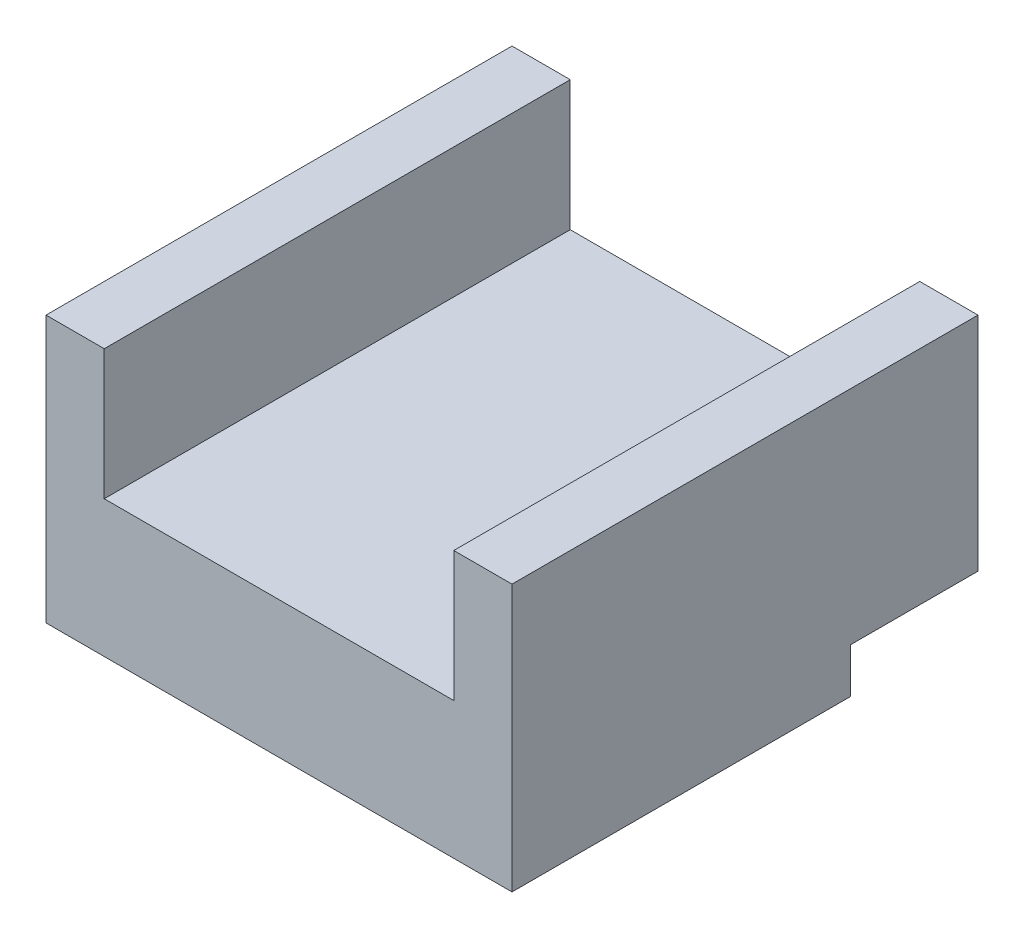
ISO-10303-21;
HEADER;
FILE_DESCRIPTION(('STEP AP214'),'2;1');
FILE_NAME('part.step','',(''),(''),'','','');
FILE_SCHEMA(('AUTOMOTIVE_DESIGN { 1 0 10303 214 1 1 1 1 }'));
ENDSEC;
DATA;
#1=APPLICATION_CONTEXT('core data for automotive mechanical design processes');
#2=APPLICATION_PROTOCOL_DEFINITION('international standard','automotive_design',2000,#1);
#3=PRODUCT_CONTEXT('',#1,'mechanical');
#4=PRODUCT('Part','Part','',(#3));
#5=PRODUCT_RELATED_PRODUCT_CATEGORY('part','',(#4));
#6=PRODUCT_DEFINITION_FORMATION('','',#4);
#7=PRODUCT_DEFINITION_CONTEXT('part definition',#1,'design');
#8=PRODUCT_DEFINITION('design','',#6,#7);
#9=PRODUCT_DEFINITION_SHAPE('','',#8);
#10=(LENGTH_UNIT() NAMED_UNIT(*) SI_UNIT(.MILLI.,.METRE.));
#11=(NAMED_UNIT(*) PLANE_ANGLE_UNIT() SI_UNIT($,.RADIAN.));
#12=(NAMED_UNIT(*) SI_UNIT($,.STERADIAN.) SOLID_ANGLE_UNIT());
#13=UNCERTAINTY_MEASURE_WITH_UNIT(LENGTH_MEASURE(1.E-05),#10,'distance_accuracy_value','');
#14=(GEOMETRIC_REPRESENTATION_CONTEXT(3) GLOBAL_UNCERTAINTY_ASSIGNED_CONTEXT((#13)) GLOBAL_UNIT_ASSIGNED_CONTEXT((#10,
#11,#12)) REPRESENTATION_CONTEXT('',''));
#15=CARTESIAN_POINT('',(0.,0.,0.));
#16=DIRECTION('',(0.,0.,1.));
#17=DIRECTION('',(1.,0.,0.));
#18=AXIS2_PLACEMENT_3D('',#15,#16,#17);
#19=CARTESIAN_POINT('',(10.4,6.1,10.4));
#20=DIRECTION('',(-1.,0.,0.));
#21=DIRECTION('',(0.,0.,1.));
#22=AXIS2_PLACEMENT_3D('',#19,#20,#21);
#23=PLANE('',#22);
#24=DIRECTION('',(0.,0.,-1.));
#25=VECTOR('',#24,1.);
#26=CARTESIAN_POINT('',(10.4,0.,10.4));
#27=LINE('',#26,#25);
#28=CARTESIAN_POINT('',(10.4,0.,10.4));
#29=VERTEX_POINT('',#28);
#30=CARTESIAN_POINT('',(10.4,0.,-4.7));
#31=VERTEX_POINT('',#30);
#32=EDGE_CURVE('E151',#29,#31,#27,.T.);
#33=ORIENTED_EDGE('',*,*,#32,.T.);
#34=DIRECTION('',(0.,-1.,0.));
#35=VECTOR('',#34,1.);
#36=CARTESIAN_POINT('',(10.4,2.,-4.7));
#37=LINE('',#36,#35);
#38=CARTESIAN_POINT('',(10.4,2.,-4.7));
#39=VERTEX_POINT('',#38);
#40=EDGE_CURVE('E53',#39,#31,#37,.T.);
#41=ORIENTED_EDGE('',*,*,#40,.F.);
#42=DIRECTION('',(0.,0.,1.));
#43=VECTOR('',#42,1.);
#44=CARTESIAN_POINT('',(10.4,2.,-10.4));
#45=LINE('',#44,#43);
#46=CARTESIAN_POINT('',(10.4,2.,-10.4));
#47=VERTEX_POINT('',#46);
#48=EDGE_CURVE('E133',#47,#39,#45,.T.);
#49=ORIENTED_EDGE('',*,*,#48,.F.);
#50=DIRECTION('',(0.,-1.,0.));
#51=VECTOR('',#50,1.);
#52=CARTESIAN_POINT('',(10.4,6.1,-10.4));
#53=LINE('',#52,#51);
#54=CARTESIAN_POINT('',(10.4,11.9,-10.4));
#55=VERTEX_POINT('',#54);
#56=EDGE_CURVE('E12',#55,#47,#53,.T.);
#57=ORIENTED_EDGE('',*,*,#56,.F.);
#58=DIRECTION('',(0.,0.,1.));
#59=VECTOR('',#58,1.);
#60=CARTESIAN_POINT('',(10.4,11.9,0.));
#61=LINE('',#60,#59);
#62=CARTESIAN_POINT('',(10.4,11.9,10.4));
#63=VERTEX_POINT('',#62);
#64=EDGE_CURVE('E180',#55,#63,#61,.T.);
#65=ORIENTED_EDGE('',*,*,#64,.T.);
#66=DIRECTION('',(0.,-1.,0.));
#67=VECTOR('',#66,1.);
#68=CARTESIAN_POINT('',(10.4,6.1,10.4));
#69=LINE('',#68,#67);
#70=EDGE_CURVE('E141',#63,#29,#69,.T.);
#71=ORIENTED_EDGE('',*,*,#70,.T.);
#72=EDGE_LOOP('',(#33,#41,#49,#57,#65,#71));
#73=FACE_BOUND('',#72,.T.);
#74=ADVANCED_FACE('F39',(#73),#23,.F.);
#75=CARTESIAN_POINT('',(-10.4,6.1,-10.4));
#76=DIRECTION('',(0.,0.,1.));
#77=DIRECTION('',(1.,0.,0.));
#78=AXIS2_PLACEMENT_3D('',#75,#76,#77);
#79=PLANE('',#78);
#80=ORIENTED_EDGE('',*,*,#56,.T.);
#81=DIRECTION('',(1.,0.,0.));
#82=VECTOR('',#81,1.);
#83=CARTESIAN_POINT('',(-10.4,2.,-10.4));
#84=LINE('',#83,#82);
#85=CARTESIAN_POINT('',(-10.4,2.,-10.4));
#86=VERTEX_POINT('',#85);
#87=EDGE_CURVE('E120',#86,#47,#84,.T.);
#88=ORIENTED_EDGE('',*,*,#87,.F.);
#89=DIRECTION('',(0.,-1.,0.));
#90=VECTOR('',#89,1.);
#91=CARTESIAN_POINT('',(-10.4,6.1,-10.4));
#92=LINE('',#91,#90);
#93=CARTESIAN_POINT('',(-10.4,11.9,-10.4));
#94=VERTEX_POINT('',#93);
#95=EDGE_CURVE('E46',#94,#86,#92,.T.);
#96=ORIENTED_EDGE('',*,*,#95,.F.);
#97=DIRECTION('',(1.,0.,0.));
#98=VECTOR('',#97,1.);
#99=CARTESIAN_POINT('',(0.,11.9,-10.4));
#100=LINE('',#99,#98);
#101=CARTESIAN_POINT('',(-7.8,11.9,-10.4));
#102=VERTEX_POINT('',#101);
#103=EDGE_CURVE('E162',#94,#102,#100,.T.);
#104=ORIENTED_EDGE('',*,*,#103,.T.);
#105=DIRECTION('',(0.,-1.,0.));
#106=VECTOR('',#105,1.);
#107=CARTESIAN_POINT('',(-7.8,11.9,-10.4));
#108=LINE('',#107,#106);
#109=CARTESIAN_POINT('',(-7.8,6.1,-10.4));
#110=VERTEX_POINT('',#109);
#111=EDGE_CURVE('E158',#102,#110,#108,.T.);
#112=ORIENTED_EDGE('',*,*,#111,.T.);
#113=DIRECTION('',(-1.,0.,0.));
#114=VECTOR('',#113,1.);
#115=CARTESIAN_POINT('',(-10.4,6.1,-10.4));
#116=LINE('',#115,#114);
#117=CARTESIAN_POINT('',(7.8,6.1,-10.4));
#118=VERTEX_POINT('',#117);
#119=EDGE_CURVE('E148',#118,#110,#116,.T.);
#120=ORIENTED_EDGE('',*,*,#119,.F.);
#121=DIRECTION('',(0.,-1.,0.));
#122=VECTOR('',#121,1.);
#123=CARTESIAN_POINT('',(7.8,11.9,-10.4));
#124=LINE('',#123,#122);
#125=CARTESIAN_POINT('',(7.8,11.9,-10.4));
#126=VERTEX_POINT('',#125);
#127=EDGE_CURVE('E186',#126,#118,#124,.T.);
#128=ORIENTED_EDGE('',*,*,#127,.F.);
#129=DIRECTION('',(1.,0.,0.));
#130=VECTOR('',#129,1.);
#131=CARTESIAN_POINT('',(0.,11.9,-10.4));
#132=LINE('',#131,#130);
#133=EDGE_CURVE('E178',#126,#55,#132,.T.);
#134=ORIENTED_EDGE('',*,*,#133,.T.);
#135=EDGE_LOOP('',(#80,#88,#96,#104,#112,#120,#128,#134));
#136=FACE_BOUND('',#135,.T.);
#137=ADVANCED_FACE('F129',(#136),#79,.F.);
#138=CARTESIAN_POINT('',(-10.4,6.1,10.4));
#139=DIRECTION('',(1.,0.,0.));
#140=DIRECTION('',(0.,0.,-1.));
#141=AXIS2_PLACEMENT_3D('',#138,#139,#140);
#142=PLANE('',#141);
#143=DIRECTION('',(0.,0.,-1.));
#144=VECTOR('',#143,1.);
#145=CARTESIAN_POINT('',(-10.4,2.,-10.4));
#146=LINE('',#145,#144);
#147=CARTESIAN_POINT('',(-10.4,2.,-4.7));
#148=VERTEX_POINT('',#147);
#149=EDGE_CURVE('E117',#148,#86,#146,.T.);
#150=ORIENTED_EDGE('',*,*,#149,.F.);
#151=DIRECTION('',(0.,-1.,0.));
#152=VECTOR('',#151,1.);
#153=CARTESIAN_POINT('',(-10.4,2.,-4.7));
#154=LINE('',#153,#152);
#155=CARTESIAN_POINT('',(-10.4,0.,-4.7));
#156=VERTEX_POINT('',#155);
#157=EDGE_CURVE('E190',#148,#156,#154,.T.);
#158=ORIENTED_EDGE('',*,*,#157,.T.);
#159=DIRECTION('',(0.,0.,1.));
#160=VECTOR('',#159,1.);
#161=CARTESIAN_POINT('',(-10.4,0.,10.4));
#162=LINE('',#161,#160);
#163=CARTESIAN_POINT('',(-10.4,0.,10.4));
#164=VERTEX_POINT('',#163);
#165=EDGE_CURVE('E149',#156,#164,#162,.T.);
#166=ORIENTED_EDGE('',*,*,#165,.T.);
#167=DIRECTION('',(0.,-1.,0.));
#168=VECTOR('',#167,1.);
#169=CARTESIAN_POINT('',(-10.4,6.1,10.4));
#170=LINE('',#169,#168);
#171=CARTESIAN_POINT('',(-10.4,11.9,10.4));
#172=VERTEX_POINT('',#171);
#173=EDGE_CURVE('E139',#172,#164,#170,.T.);
#174=ORIENTED_EDGE('',*,*,#173,.F.);
#175=DIRECTION('',(0.,0.,-1.));
#176=VECTOR('',#175,1.);
#177=CARTESIAN_POINT('',(-10.4,11.9,0.));
#178=LINE('',#177,#176);
#179=EDGE_CURVE('E137',#172,#94,#178,.T.);
#180=ORIENTED_EDGE('',*,*,#179,.T.);
#181=ORIENTED_EDGE('',*,*,#95,.T.);
#182=EDGE_LOOP('',(#150,#158,#166,#174,#180,#181));
#183=FACE_BOUND('',#182,.T.);
#184=ADVANCED_FACE('F135',(#183),#142,.F.);
#185=CARTESIAN_POINT('',(-10.4,6.1,10.4));
#186=DIRECTION('',(0.,0.,-1.));
#187=DIRECTION('',(-1.,0.,0.));
#188=AXIS2_PLACEMENT_3D('',#185,#186,#187);
#189=PLANE('',#188);
#190=DIRECTION('',(1.,0.,0.));
#191=VECTOR('',#190,1.);
#192=CARTESIAN_POINT('',(-10.4,0.,10.4));
#193=LINE('',#192,#191);
#194=EDGE_CURVE('E146',#164,#29,#193,.T.);
#195=ORIENTED_EDGE('',*,*,#194,.T.);
#196=ORIENTED_EDGE('',*,*,#70,.F.);
#197=DIRECTION('',(-1.,0.,0.));
#198=VECTOR('',#197,1.);
#199=CARTESIAN_POINT('',(0.,11.9,10.4));
#200=LINE('',#199,#198);
#201=CARTESIAN_POINT('',(7.8,11.9,10.4));
#202=VERTEX_POINT('',#201);
#203=EDGE_CURVE('E183',#63,#202,#200,.T.);
#204=ORIENTED_EDGE('',*,*,#203,.T.);
#205=DIRECTION('',(0.,-1.,0.));
#206=VECTOR('',#205,1.);
#207=CARTESIAN_POINT('',(7.8,11.9,10.4));
#208=LINE('',#207,#206);
#209=CARTESIAN_POINT('',(7.8,6.1,10.4));
#210=VERTEX_POINT('',#209);
#211=EDGE_CURVE('E187',#202,#210,#208,.T.);
#212=ORIENTED_EDGE('',*,*,#211,.T.);
#213=DIRECTION('',(1.,0.,0.));
#214=VECTOR('',#213,1.);
#215=CARTESIAN_POINT('',(-10.4,6.1,10.4));
#216=LINE('',#215,#214);
#217=CARTESIAN_POINT('',(-7.8,6.1,10.4));
#218=VERTEX_POINT('',#217);
#219=EDGE_CURVE('E61',#218,#210,#216,.T.);
#220=ORIENTED_EDGE('',*,*,#219,.F.);
#221=DIRECTION('',(0.,-1.,0.));
#222=VECTOR('',#221,1.);
#223=CARTESIAN_POINT('',(-7.8,11.9,10.4));
#224=LINE('',#223,#222);
#225=CARTESIAN_POINT('',(-7.8,11.9,10.4));
#226=VERTEX_POINT('',#225);
#227=EDGE_CURVE('E159',#226,#218,#224,.T.);
#228=ORIENTED_EDGE('',*,*,#227,.F.);
#229=DIRECTION('',(-1.,0.,0.));
#230=VECTOR('',#229,1.);
#231=CARTESIAN_POINT('',(0.,11.9,10.4));
#232=LINE('',#231,#230);
#233=EDGE_CURVE('E167',#226,#172,#232,.T.);
#234=ORIENTED_EDGE('',*,*,#233,.T.);
#235=ORIENTED_EDGE('',*,*,#173,.T.);
#236=EDGE_LOOP('',(#195,#196,#204,#212,#220,#228,#234,#235));
#237=FACE_BOUND('',#236,.T.);
#238=ADVANCED_FACE('F205',(#237),#189,.F.);
#239=CARTESIAN_POINT('',(0.,6.1,0.));
#240=DIRECTION('',(0.,-1.,0.));
#241=DIRECTION('',(0.,0.,-1.));
#242=AXIS2_PLACEMENT_3D('',#239,#240,#241);
#243=PLANE('',#242);
#244=ORIENTED_EDGE('',*,*,#219,.T.);
#245=DIRECTION('',(0.,0.,-1.));
#246=VECTOR('',#245,1.);
#247=CARTESIAN_POINT('',(7.8,6.1,0.));
#248=LINE('',#247,#246);
#249=EDGE_CURVE('E173',#210,#118,#248,.T.);
#250=ORIENTED_EDGE('',*,*,#249,.T.);
#251=ORIENTED_EDGE('',*,*,#119,.T.);
#252=DIRECTION('',(0.,0.,1.));
#253=VECTOR('',#252,1.);
#254=CARTESIAN_POINT('',(-7.8,6.1,0.));
#255=LINE('',#254,#253);
#256=EDGE_CURVE('E154',#110,#218,#255,.T.);
#257=ORIENTED_EDGE('',*,*,#256,.T.);
#258=EDGE_LOOP('',(#244,#250,#251,#257));
#259=FACE_BOUND('',#258,.T.);
#260=ADVANCED_FACE('F214',(#259),#243,.F.);
#261=CARTESIAN_POINT('',(0.,0.,0.));
#262=DIRECTION('',(0.,-1.,0.));
#263=DIRECTION('',(0.,0.,-1.));
#264=AXIS2_PLACEMENT_3D('',#261,#262,#263);
#265=PLANE('',#264);
#266=DIRECTION('',(-1.,0.,0.));
#267=VECTOR('',#266,1.);
#268=CARTESIAN_POINT('',(-10.4,0.,-4.7));
#269=LINE('',#268,#267);
#270=EDGE_CURVE('E126',#31,#156,#269,.T.);
#271=ORIENTED_EDGE('',*,*,#270,.F.);
#272=ORIENTED_EDGE('',*,*,#32,.F.);
#273=ORIENTED_EDGE('',*,*,#194,.F.);
#274=ORIENTED_EDGE('',*,*,#165,.F.);
#275=EDGE_LOOP('',(#271,#272,#273,#274));
#276=FACE_BOUND('',#275,.T.);
#277=ADVANCED_FACE('F202',(#276),#265,.T.);
#278=CARTESIAN_POINT('',(-7.8,11.9,0.));
#279=DIRECTION('',(1.,0.,0.));
#280=DIRECTION('',(0.,0.,-1.));
#281=AXIS2_PLACEMENT_3D('',#278,#279,#280);
#282=PLANE('',#281);
#283=ORIENTED_EDGE('',*,*,#256,.F.);
#284=ORIENTED_EDGE('',*,*,#111,.F.);
#285=DIRECTION('',(0.,0.,1.));
#286=VECTOR('',#285,1.);
#287=CARTESIAN_POINT('',(-7.8,11.9,0.));
#288=LINE('',#287,#286);
#289=EDGE_CURVE('E170',#102,#226,#288,.T.);
#290=ORIENTED_EDGE('',*,*,#289,.T.);
#291=ORIENTED_EDGE('',*,*,#227,.T.);
#292=EDGE_LOOP('',(#283,#284,#290,#291));
#293=FACE_BOUND('',#292,.T.);
#294=ADVANCED_FACE('F212',(#293),#282,.T.);
#295=CARTESIAN_POINT('',(0.,11.9,0.));
#296=DIRECTION('',(0.,-1.,0.));
#297=DIRECTION('',(0.,0.,-1.));
#298=AXIS2_PLACEMENT_3D('',#295,#296,#297);
#299=PLANE('',#298);
#300=ORIENTED_EDGE('',*,*,#289,.F.);
#301=ORIENTED_EDGE('',*,*,#103,.F.);
#302=ORIENTED_EDGE('',*,*,#179,.F.);
#303=ORIENTED_EDGE('',*,*,#233,.F.);
#304=EDGE_LOOP('',(#300,#301,#302,#303));
#305=FACE_BOUND('',#304,.T.);
#306=ADVANCED_FACE('F209',(#305),#299,.F.);
#307=CARTESIAN_POINT('',(7.8,11.9,0.));
#308=DIRECTION('',(-1.,0.,0.));
#309=DIRECTION('',(0.,0.,1.));
#310=AXIS2_PLACEMENT_3D('',#307,#308,#309);
#311=PLANE('',#310);
#312=ORIENTED_EDGE('',*,*,#249,.F.);
#313=ORIENTED_EDGE('',*,*,#211,.F.);
#314=DIRECTION('',(0.,0.,-1.));
#315=VECTOR('',#314,1.);
#316=CARTESIAN_POINT('',(7.8,11.9,0.));
#317=LINE('',#316,#315);
#318=EDGE_CURVE('E175',#202,#126,#317,.T.);
#319=ORIENTED_EDGE('',*,*,#318,.T.);
#320=ORIENTED_EDGE('',*,*,#127,.T.);
#321=EDGE_LOOP('',(#312,#313,#319,#320));
#322=FACE_BOUND('',#321,.T.);
#323=ADVANCED_FACE('F216',(#322),#311,.T.);
#324=CARTESIAN_POINT('',(0.,11.9,0.));
#325=DIRECTION('',(0.,-1.,0.));
#326=DIRECTION('',(0.,0.,-1.));
#327=AXIS2_PLACEMENT_3D('',#324,#325,#326);
#328=PLANE('',#327);
#329=ORIENTED_EDGE('',*,*,#318,.F.);
#330=ORIENTED_EDGE('',*,*,#203,.F.);
#331=ORIENTED_EDGE('',*,*,#64,.F.);
#332=ORIENTED_EDGE('',*,*,#133,.F.);
#333=EDGE_LOOP('',(#329,#330,#331,#332));
#334=FACE_BOUND('',#333,.T.);
#335=ADVANCED_FACE('F220',(#334),#328,.F.);
#336=CARTESIAN_POINT('',(-10.4,2.,-4.7));
#337=DIRECTION('',(0.,0.,1.));
#338=DIRECTION('',(1.,0.,0.));
#339=AXIS2_PLACEMENT_3D('',#336,#337,#338);
#340=PLANE('',#339);
#341=ORIENTED_EDGE('',*,*,#270,.T.);
#342=ORIENTED_EDGE('',*,*,#157,.F.);
#343=DIRECTION('',(-1.,0.,0.));
#344=VECTOR('',#343,1.);
#345=CARTESIAN_POINT('',(-10.4,2.,-4.7));
#346=LINE('',#345,#344);
#347=EDGE_CURVE('E122',#39,#148,#346,.T.);
#348=ORIENTED_EDGE('',*,*,#347,.F.);
#349=ORIENTED_EDGE('',*,*,#40,.T.);
#350=EDGE_LOOP('',(#341,#342,#348,#349));
#351=FACE_BOUND('',#350,.T.);
#352=ADVANCED_FACE('F198',(#351),#340,.F.);
#353=CARTESIAN_POINT('',(0.,2.,0.));
#354=DIRECTION('',(0.,1.,0.));
#355=DIRECTION('',(0.,0.,1.));
#356=AXIS2_PLACEMENT_3D('',#353,#354,#355);
#357=PLANE('',#356);
#358=ORIENTED_EDGE('',*,*,#149,.T.);
#359=ORIENTED_EDGE('',*,*,#87,.T.);
#360=ORIENTED_EDGE('',*,*,#48,.T.);
#361=ORIENTED_EDGE('',*,*,#347,.T.);
#362=EDGE_LOOP('',(#358,#359,#360,#361));
#363=FACE_BOUND('',#362,.T.);
#364=ADVANCED_FACE('F119',(#363),#357,.F.);
#365=CLOSED_SHELL('',(#74,#137,#184,#238,#260,#277,#294,#306,#323,#335,#352,#364));
#366=MANIFOLD_SOLID_BREP('B2',#365);
#367=ADVANCED_BREP_SHAPE_REPRESENTATION('',(#18,#366),#14);
#368=SHAPE_DEFINITION_REPRESENTATION(#9,#367);
ENDSEC;
END-ISO-10303-21;
